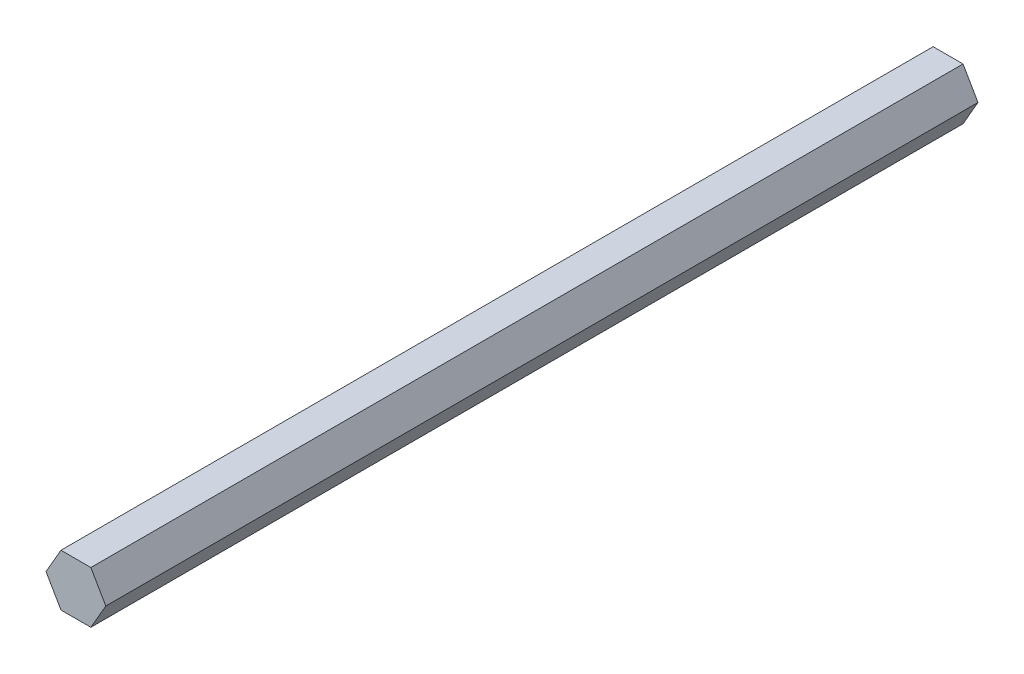
ISO-10303-21;
HEADER;
FILE_DESCRIPTION(('STEP AP214'),'2;1');
FILE_NAME('part.step','',(''),(''),'','','');
FILE_SCHEMA(('AUTOMOTIVE_DESIGN { 1 0 10303 214 1 1 1 1 }'));
ENDSEC;
DATA;
#1=APPLICATION_CONTEXT('core data for automotive mechanical design processes');
#2=APPLICATION_PROTOCOL_DEFINITION('international standard','automotive_design',2000,#1);
#3=PRODUCT_CONTEXT('',#1,'mechanical');
#4=PRODUCT('Part','Part','',(#3));
#5=PRODUCT_RELATED_PRODUCT_CATEGORY('part','',(#4));
#6=PRODUCT_DEFINITION_FORMATION('','',#4);
#7=PRODUCT_DEFINITION_CONTEXT('part definition',#1,'design');
#8=PRODUCT_DEFINITION('design','',#6,#7);
#9=PRODUCT_DEFINITION_SHAPE('','',#8);
#10=(LENGTH_UNIT() NAMED_UNIT(*) SI_UNIT(.MILLI.,.METRE.));
#11=(NAMED_UNIT(*) PLANE_ANGLE_UNIT() SI_UNIT($,.RADIAN.));
#12=(NAMED_UNIT(*) SI_UNIT($,.STERADIAN.) SOLID_ANGLE_UNIT());
#13=UNCERTAINTY_MEASURE_WITH_UNIT(LENGTH_MEASURE(1.E-05),#10,'distance_accuracy_value','');
#14=(GEOMETRIC_REPRESENTATION_CONTEXT(3) GLOBAL_UNCERTAINTY_ASSIGNED_CONTEXT((#13)) GLOBAL_UNIT_ASSIGNED_CONTEXT((#10,
#11,#12)) REPRESENTATION_CONTEXT('',''));
#15=CARTESIAN_POINT('',(0.,0.,0.));
#16=DIRECTION('',(0.,0.,1.));
#17=DIRECTION('',(1.,0.,0.));
#18=AXIS2_PLACEMENT_3D('',#15,#16,#17);
#19=CARTESIAN_POINT('',(1.49999999999999,-2.5980762113533,87.5));
#20=DIRECTION('',(-0.866025403784439,0.5,0.));
#21=DIRECTION('',(-0.5,-0.866025403784439,0.));
#22=AXIS2_PLACEMENT_3D('',#19,#20,#21);
#23=PLANE('',#22);
#24=DIRECTION('',(0.5,0.866025403784439,0.));
#25=VECTOR('',#24,1.);
#26=CARTESIAN_POINT('',(1.49999999999999,-2.5980762113533,0.));
#27=LINE('',#26,#25);
#28=CARTESIAN_POINT('',(1.49999999999999,-2.5980762113533,0.));
#29=VERTEX_POINT('',#28);
#30=CARTESIAN_POINT('',(2.99999999999998,0.,0.));
#31=VERTEX_POINT('',#30);
#32=EDGE_CURVE('E128',#29,#31,#27,.T.);
#33=ORIENTED_EDGE('',*,*,#32,.T.);
#34=DIRECTION('',(0.,0.,-1.));
#35=VECTOR('',#34,1.);
#36=CARTESIAN_POINT('',(2.99999999999998,0.,87.5));
#37=LINE('',#36,#35);
#38=CARTESIAN_POINT('',(2.99999999999998,0.,87.5));
#39=VERTEX_POINT('',#38);
#40=EDGE_CURVE('E11',#39,#31,#37,.T.);
#41=ORIENTED_EDGE('',*,*,#40,.F.);
#42=DIRECTION('',(0.5,0.866025403784439,0.));
#43=VECTOR('',#42,1.);
#44=CARTESIAN_POINT('',(1.49999999999999,-2.5980762113533,87.5));
#45=LINE('',#44,#43);
#46=CARTESIAN_POINT('',(1.49999999999999,-2.5980762113533,87.5));
#47=VERTEX_POINT('',#46);
#48=EDGE_CURVE('E144',#47,#39,#45,.T.);
#49=ORIENTED_EDGE('',*,*,#48,.F.);
#50=DIRECTION('',(0.,0.,-1.));
#51=VECTOR('',#50,1.);
#52=CARTESIAN_POINT('',(1.49999999999999,-2.5980762113533,87.5));
#53=LINE('',#52,#51);
#54=EDGE_CURVE('E124',#47,#29,#53,.T.);
#55=ORIENTED_EDGE('',*,*,#54,.T.);
#56=EDGE_LOOP('',(#33,#41,#49,#55));
#57=FACE_BOUND('',#56,.T.);
#58=ADVANCED_FACE('F39',(#57),#23,.F.);
#59=CARTESIAN_POINT('',(2.99999999999998,0.,87.5));
#60=DIRECTION('',(-0.866025403784439,-0.5,0.));
#61=DIRECTION('',(0.5,-0.866025403784439,0.));
#62=AXIS2_PLACEMENT_3D('',#59,#60,#61);
#63=PLANE('',#62);
#64=DIRECTION('',(-0.5,0.866025403784439,0.));
#65=VECTOR('',#64,1.);
#66=CARTESIAN_POINT('',(2.99999999999998,0.,0.));
#67=LINE('',#66,#65);
#68=CARTESIAN_POINT('',(1.49999999999999,2.5980762113533,0.));
#69=VERTEX_POINT('',#68);
#70=EDGE_CURVE('E132',#31,#69,#67,.T.);
#71=ORIENTED_EDGE('',*,*,#70,.T.);
#72=DIRECTION('',(0.,0.,-1.));
#73=VECTOR('',#72,1.);
#74=CARTESIAN_POINT('',(1.49999999999999,2.5980762113533,87.5));
#75=LINE('',#74,#73);
#76=CARTESIAN_POINT('',(1.49999999999999,2.5980762113533,87.5));
#77=VERTEX_POINT('',#76);
#78=EDGE_CURVE('E48',#77,#69,#75,.T.);
#79=ORIENTED_EDGE('',*,*,#78,.F.);
#80=DIRECTION('',(-0.5,0.866025403784439,0.));
#81=VECTOR('',#80,1.);
#82=CARTESIAN_POINT('',(2.99999999999998,0.,87.5));
#83=LINE('',#82,#81);
#84=EDGE_CURVE('E93',#39,#77,#83,.T.);
#85=ORIENTED_EDGE('',*,*,#84,.F.);
#86=ORIENTED_EDGE('',*,*,#40,.T.);
#87=EDGE_LOOP('',(#71,#79,#85,#86));
#88=FACE_BOUND('',#87,.T.);
#89=ADVANCED_FACE('F172',(#88),#63,.F.);
#90=CARTESIAN_POINT('',(1.49999999999999,2.5980762113533,87.5));
#91=DIRECTION('',(0.,-1.,0.));
#92=DIRECTION('',(1.,0.,0.));
#93=AXIS2_PLACEMENT_3D('',#90,#91,#92);
#94=PLANE('',#93);
#95=DIRECTION('',(-1.,0.,0.));
#96=VECTOR('',#95,1.);
#97=CARTESIAN_POINT('',(1.49999999999999,2.5980762113533,0.));
#98=LINE('',#97,#96);
#99=CARTESIAN_POINT('',(-1.49999999999999,2.5980762113533,0.));
#100=VERTEX_POINT('',#99);
#101=EDGE_CURVE('E135',#69,#100,#98,.T.);
#102=ORIENTED_EDGE('',*,*,#101,.T.);
#103=DIRECTION('',(0.,0.,-1.));
#104=VECTOR('',#103,1.);
#105=CARTESIAN_POINT('',(-1.49999999999999,2.5980762113533,87.5));
#106=LINE('',#105,#104);
#107=CARTESIAN_POINT('',(-1.49999999999999,2.5980762113533,87.5));
#108=VERTEX_POINT('',#107);
#109=EDGE_CURVE('E117',#108,#100,#106,.T.);
#110=ORIENTED_EDGE('',*,*,#109,.F.);
#111=DIRECTION('',(-1.,0.,0.));
#112=VECTOR('',#111,1.);
#113=CARTESIAN_POINT('',(1.49999999999999,2.5980762113533,87.5));
#114=LINE('',#113,#112);
#115=EDGE_CURVE('E106',#77,#108,#114,.T.);
#116=ORIENTED_EDGE('',*,*,#115,.F.);
#117=ORIENTED_EDGE('',*,*,#78,.T.);
#118=EDGE_LOOP('',(#102,#110,#116,#117));
#119=FACE_BOUND('',#118,.T.);
#120=ADVANCED_FACE('F154',(#119),#94,.F.);
#121=CARTESIAN_POINT('',(-1.49999999999999,2.5980762113533,87.5));
#122=DIRECTION('',(0.866025403784439,-0.5,0.));
#123=DIRECTION('',(0.5,0.866025403784439,0.));
#124=AXIS2_PLACEMENT_3D('',#121,#122,#123);
#125=PLANE('',#124);
#126=DIRECTION('',(-0.5,-0.866025403784439,0.));
#127=VECTOR('',#126,1.);
#128=CARTESIAN_POINT('',(-1.49999999999999,2.5980762113533,0.));
#129=LINE('',#128,#127);
#130=CARTESIAN_POINT('',(-2.99999999999998,0.,0.));
#131=VERTEX_POINT('',#130);
#132=EDGE_CURVE('E115',#100,#131,#129,.T.);
#133=ORIENTED_EDGE('',*,*,#132,.T.);
#134=DIRECTION('',(0.,0.,-1.));
#135=VECTOR('',#134,1.);
#136=CARTESIAN_POINT('',(-2.99999999999998,0.,87.5));
#137=LINE('',#136,#135);
#138=CARTESIAN_POINT('',(-2.99999999999998,0.,87.5));
#139=VERTEX_POINT('',#138);
#140=EDGE_CURVE('E112',#139,#131,#137,.T.);
#141=ORIENTED_EDGE('',*,*,#140,.F.);
#142=DIRECTION('',(-0.5,-0.866025403784439,0.));
#143=VECTOR('',#142,1.);
#144=CARTESIAN_POINT('',(-1.49999999999999,2.5980762113533,87.5));
#145=LINE('',#144,#143);
#146=EDGE_CURVE('E100',#108,#139,#145,.T.);
#147=ORIENTED_EDGE('',*,*,#146,.F.);
#148=ORIENTED_EDGE('',*,*,#109,.T.);
#149=EDGE_LOOP('',(#133,#141,#147,#148));
#150=FACE_BOUND('',#149,.T.);
#151=ADVANCED_FACE('F113',(#150),#125,.F.);
#152=CARTESIAN_POINT('',(-2.99999999999998,0.,87.5));
#153=DIRECTION('',(0.866025403784439,0.5,0.));
#154=DIRECTION('',(-0.5,0.866025403784439,0.));
#155=AXIS2_PLACEMENT_3D('',#152,#153,#154);
#156=PLANE('',#155);
#157=DIRECTION('',(0.5,-0.866025403784439,0.));
#158=VECTOR('',#157,1.);
#159=CARTESIAN_POINT('',(-2.99999999999998,0.,0.));
#160=LINE('',#159,#158);
#161=CARTESIAN_POINT('',(-1.49999999999999,-2.5980762113533,0.));
#162=VERTEX_POINT('',#161);
#163=EDGE_CURVE('E79',#131,#162,#160,.T.);
#164=ORIENTED_EDGE('',*,*,#163,.T.);
#165=DIRECTION('',(0.,0.,-1.));
#166=VECTOR('',#165,1.);
#167=CARTESIAN_POINT('',(-1.49999999999999,-2.5980762113533,87.5));
#168=LINE('',#167,#166);
#169=CARTESIAN_POINT('',(-1.49999999999999,-2.5980762113533,87.5));
#170=VERTEX_POINT('',#169);
#171=EDGE_CURVE('E118',#170,#162,#168,.T.);
#172=ORIENTED_EDGE('',*,*,#171,.F.);
#173=DIRECTION('',(0.5,-0.866025403784439,0.));
#174=VECTOR('',#173,1.);
#175=CARTESIAN_POINT('',(-2.99999999999998,0.,87.5));
#176=LINE('',#175,#174);
#177=EDGE_CURVE('E104',#139,#170,#176,.T.);
#178=ORIENTED_EDGE('',*,*,#177,.F.);
#179=ORIENTED_EDGE('',*,*,#140,.T.);
#180=EDGE_LOOP('',(#164,#172,#178,#179));
#181=FACE_BOUND('',#180,.T.);
#182=ADVANCED_FACE('F120',(#181),#156,.F.);
#183=CARTESIAN_POINT('',(-1.49999999999999,-2.5980762113533,87.5));
#184=DIRECTION('',(0.,1.,0.));
#185=DIRECTION('',(-1.,0.,0.));
#186=AXIS2_PLACEMENT_3D('',#183,#184,#185);
#187=PLANE('',#186);
#188=DIRECTION('',(1.,0.,0.));
#189=VECTOR('',#188,1.);
#190=CARTESIAN_POINT('',(-1.49999999999999,-2.5980762113533,0.));
#191=LINE('',#190,#189);
#192=EDGE_CURVE('E85',#162,#29,#191,.T.);
#193=ORIENTED_EDGE('',*,*,#192,.T.);
#194=ORIENTED_EDGE('',*,*,#54,.F.);
#195=DIRECTION('',(1.,0.,0.));
#196=VECTOR('',#195,1.);
#197=CARTESIAN_POINT('',(-1.49999999999999,-2.5980762113533,87.5));
#198=LINE('',#197,#196);
#199=EDGE_CURVE('E56',#170,#47,#198,.T.);
#200=ORIENTED_EDGE('',*,*,#199,.F.);
#201=ORIENTED_EDGE('',*,*,#171,.T.);
#202=EDGE_LOOP('',(#193,#194,#200,#201));
#203=FACE_BOUND('',#202,.T.);
#204=ADVANCED_FACE('F161',(#203),#187,.F.);
#205=CARTESIAN_POINT('',(0.,0.,87.5));
#206=DIRECTION('',(0.,0.,1.));
#207=DIRECTION('',(1.,0.,0.));
#208=AXIS2_PLACEMENT_3D('',#205,#206,#207);
#209=PLANE('',#208);
#210=ORIENTED_EDGE('',*,*,#48,.T.);
#211=ORIENTED_EDGE('',*,*,#84,.T.);
#212=ORIENTED_EDGE('',*,*,#115,.T.);
#213=ORIENTED_EDGE('',*,*,#146,.T.);
#214=ORIENTED_EDGE('',*,*,#177,.T.);
#215=ORIENTED_EDGE('',*,*,#199,.T.);
#216=EDGE_LOOP('',(#210,#211,#212,#213,#214,#215));
#217=FACE_BOUND('',#216,.T.);
#218=ADVANCED_FACE('F102',(#217),#209,.T.);
#219=CARTESIAN_POINT('',(0.,0.,0.));
#220=DIRECTION('',(0.,0.,1.));
#221=DIRECTION('',(1.,0.,0.));
#222=AXIS2_PLACEMENT_3D('',#219,#220,#221);
#223=PLANE('',#222);
#224=ORIENTED_EDGE('',*,*,#32,.F.);
#225=ORIENTED_EDGE('',*,*,#192,.F.);
#226=ORIENTED_EDGE('',*,*,#163,.F.);
#227=ORIENTED_EDGE('',*,*,#132,.F.);
#228=ORIENTED_EDGE('',*,*,#101,.F.);
#229=ORIENTED_EDGE('',*,*,#70,.F.);
#230=EDGE_LOOP('',(#224,#225,#226,#227,#228,#229));
#231=FACE_BOUND('',#230,.T.);
#232=ADVANCED_FACE('F157',(#231),#223,.F.);
#233=CLOSED_SHELL('',(#58,#89,#120,#151,#182,#204,#218,#232));
#234=MANIFOLD_SOLID_BREP('B2',#233);
#235=ADVANCED_BREP_SHAPE_REPRESENTATION('',(#18,#234),#14);
#236=SHAPE_DEFINITION_REPRESENTATION(#9,#235);
ENDSEC;
END-ISO-10303-21;
